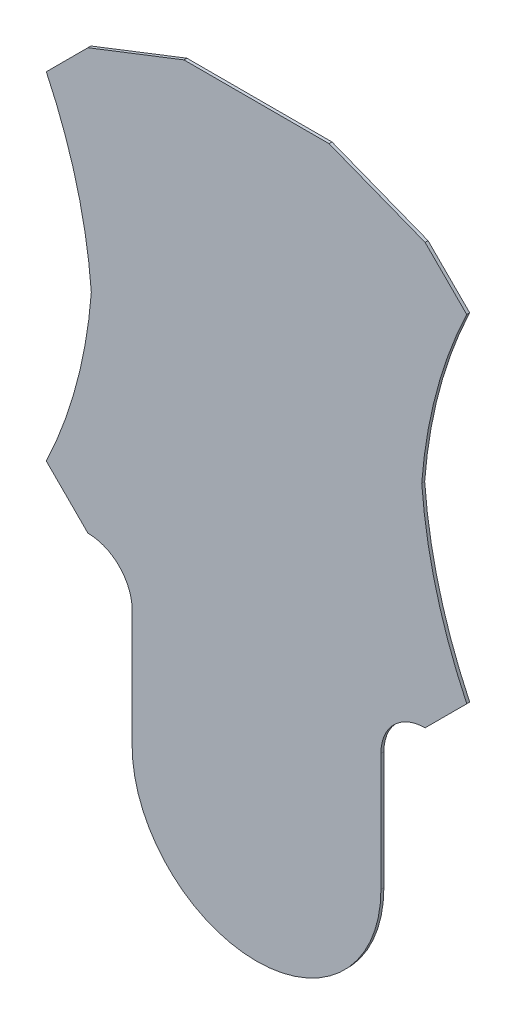
ISO-10303-21;
HEADER;
FILE_DESCRIPTION(('STEP AP214'),'2;1');
FILE_NAME('part.step','',(''),(''),'','','');
FILE_SCHEMA(('AUTOMOTIVE_DESIGN { 1 0 10303 214 1 1 1 1 }'));
ENDSEC;
DATA;
#1=APPLICATION_CONTEXT('core data for automotive mechanical design processes');
#2=APPLICATION_PROTOCOL_DEFINITION('international standard','automotive_design',2000,#1);
#3=PRODUCT_CONTEXT('',#1,'mechanical');
#4=PRODUCT('Part','Part','',(#3));
#5=PRODUCT_RELATED_PRODUCT_CATEGORY('part','',(#4));
#6=PRODUCT_DEFINITION_FORMATION('','',#4);
#7=PRODUCT_DEFINITION_CONTEXT('part definition',#1,'design');
#8=PRODUCT_DEFINITION('design','',#6,#7);
#9=PRODUCT_DEFINITION_SHAPE('','',#8);
#10=(LENGTH_UNIT() NAMED_UNIT(*) SI_UNIT(.MILLI.,.METRE.));
#11=(NAMED_UNIT(*) PLANE_ANGLE_UNIT() SI_UNIT($,.RADIAN.));
#12=(NAMED_UNIT(*) SI_UNIT($,.STERADIAN.) SOLID_ANGLE_UNIT());
#13=UNCERTAINTY_MEASURE_WITH_UNIT(LENGTH_MEASURE(1.E-05),#10,'distance_accuracy_value','');
#14=(GEOMETRIC_REPRESENTATION_CONTEXT(3) GLOBAL_UNCERTAINTY_ASSIGNED_CONTEXT((#13)) GLOBAL_UNIT_ASSIGNED_CONTEXT((#10,
#11,#12)) REPRESENTATION_CONTEXT('',''));
#15=CARTESIAN_POINT('',(0.,0.,0.));
#16=DIRECTION('',(0.,0.,1.));
#17=DIRECTION('',(1.,0.,0.));
#18=AXIS2_PLACEMENT_3D('',#15,#16,#17);
#19=CARTESIAN_POINT('',(142.766074480611,114.48180323315,2.));
#20=DIRECTION('',(-0.707106781186545,-0.70710678118655,0.));
#21=DIRECTION('',(0.70710678118655,-0.707106781186545,0.));
#22=AXIS2_PLACEMENT_3D('',#19,#20,#21);
#23=PLANE('',#22);
#24=DIRECTION('',(-0.70710678118655,0.707106781186545,0.));
#25=VECTOR('',#24,1.);
#26=CARTESIAN_POINT('',(142.766074480611,114.48180323315,0.));
#27=LINE('',#26,#25);
#28=CARTESIAN_POINT('',(142.766074480611,114.481803233151,0.));
#29=VERTEX_POINT('',#28);
#30=CARTESIAN_POINT('',(114.48180323315,142.766074480612,0.));
#31=VERTEX_POINT('',#30);
#32=EDGE_CURVE('E179',#29,#31,#27,.T.);
#33=ORIENTED_EDGE('',*,*,#32,.T.);
#34=DIRECTION('',(0.,0.,-1.));
#35=VECTOR('',#34,1.);
#36=CARTESIAN_POINT('',(114.48180323315,142.766074480612,2.));
#37=LINE('',#36,#35);
#38=CARTESIAN_POINT('',(114.48180323315,142.766074480612,2.));
#39=VERTEX_POINT('',#38);
#40=EDGE_CURVE('E11',#39,#31,#37,.T.);
#41=ORIENTED_EDGE('',*,*,#40,.F.);
#42=DIRECTION('',(-0.70710678118655,0.707106781186545,0.));
#43=VECTOR('',#42,1.);
#44=CARTESIAN_POINT('',(142.766074480611,114.48180323315,2.));
#45=LINE('',#44,#43);
#46=CARTESIAN_POINT('',(142.766074480611,114.481803233151,2.));
#47=VERTEX_POINT('',#46);
#48=EDGE_CURVE('E220',#47,#39,#45,.T.);
#49=ORIENTED_EDGE('',*,*,#48,.F.);
#50=DIRECTION('',(0.,0.,-1.));
#51=VECTOR('',#50,1.);
#52=CARTESIAN_POINT('',(142.766074480611,114.481803233151,2.));
#53=LINE('',#52,#51);
#54=EDGE_CURVE('E48',#47,#29,#53,.T.);
#55=ORIENTED_EDGE('',*,*,#54,.T.);
#56=EDGE_LOOP('',(#33,#41,#49,#55));
#57=FACE_BOUND('',#56,.T.);
#58=ADVANCED_FACE('F32',(#57),#23,.F.);
#59=CARTESIAN_POINT('',(114.48180323315,142.766074480612,2.));
#60=DIRECTION('',(-0.363403895673963,-0.931631691500985,0.));
#61=DIRECTION('',(0.931631691500985,-0.363403895673963,0.));
#62=AXIS2_PLACEMENT_3D('',#59,#60,#61);
#63=PLANE('',#62);
#64=DIRECTION('',(-0.931631691500985,0.363403895673963,0.));
#65=VECTOR('',#64,1.);
#66=CARTESIAN_POINT('',(114.48180323315,142.766074480612,0.));
#67=LINE('',#66,#65);
#68=CARTESIAN_POINT('',(49.2675848280858,168.204347177787,0.));
#69=VERTEX_POINT('',#68);
#70=EDGE_CURVE('E181',#31,#69,#67,.T.);
#71=ORIENTED_EDGE('',*,*,#70,.T.);
#72=DIRECTION('',(0.,0.,-1.));
#73=VECTOR('',#72,1.);
#74=CARTESIAN_POINT('',(49.2675848280858,168.204347177787,2.));
#75=LINE('',#74,#73);
#76=CARTESIAN_POINT('',(49.2675848280858,168.204347177787,2.));
#77=VERTEX_POINT('',#76);
#78=EDGE_CURVE('E40',#77,#69,#75,.T.);
#79=ORIENTED_EDGE('',*,*,#78,.F.);
#80=DIRECTION('',(-0.931631691500985,0.363403895673963,0.));
#81=VECTOR('',#80,1.);
#82=CARTESIAN_POINT('',(114.48180323315,142.766074480612,2.));
#83=LINE('',#82,#81);
#84=EDGE_CURVE('E111',#39,#77,#83,.T.);
#85=ORIENTED_EDGE('',*,*,#84,.F.);
#86=ORIENTED_EDGE('',*,*,#40,.T.);
#87=EDGE_LOOP('',(#71,#79,#85,#86));
#88=FACE_BOUND('',#87,.T.);
#89=ADVANCED_FACE('F252',(#88),#63,.F.);
#90=CARTESIAN_POINT('',(-49.2675848280858,168.204347177787,2.));
#91=DIRECTION('',(0.,1.,0.));
#92=DIRECTION('',(0.,0.,1.));
#93=AXIS2_PLACEMENT_3D('',#90,#91,#92);
#94=PLANE('',#93);
#95=DIRECTION('',(1.,0.,0.));
#96=VECTOR('',#95,1.);
#97=CARTESIAN_POINT('',(-49.2675848280858,168.204347177787,0.));
#98=LINE('',#97,#96);
#99=CARTESIAN_POINT('',(-49.2675848280858,168.204347177787,0.));
#100=VERTEX_POINT('',#99);
#101=EDGE_CURVE('E184',#100,#69,#98,.T.);
#102=ORIENTED_EDGE('',*,*,#101,.F.);
#103=DIRECTION('',(0.,0.,-1.));
#104=VECTOR('',#103,1.);
#105=CARTESIAN_POINT('',(-49.2675848280858,168.204347177787,2.));
#106=LINE('',#105,#104);
#107=CARTESIAN_POINT('',(-49.2675848280858,168.204347177787,2.));
#108=VERTEX_POINT('',#107);
#109=EDGE_CURVE('E245',#108,#100,#106,.T.);
#110=ORIENTED_EDGE('',*,*,#109,.F.);
#111=DIRECTION('',(1.,0.,0.));
#112=VECTOR('',#111,1.);
#113=CARTESIAN_POINT('',(-49.2675848280858,168.204347177787,2.));
#114=LINE('',#113,#112);
#115=EDGE_CURVE('E251',#108,#77,#114,.T.);
#116=ORIENTED_EDGE('',*,*,#115,.T.);
#117=ORIENTED_EDGE('',*,*,#78,.T.);
#118=EDGE_LOOP('',(#102,#110,#116,#117));
#119=FACE_BOUND('',#118,.T.);
#120=ADVANCED_FACE('F249',(#119),#94,.T.);
#121=CARTESIAN_POINT('',(-114.48180323315,142.766074480612,2.));
#122=DIRECTION('',(-0.363403895673964,0.931631691500985,0.));
#123=DIRECTION('',(-0.931631691500985,-0.363403895673964,0.));
#124=AXIS2_PLACEMENT_3D('',#121,#122,#123);
#125=PLANE('',#124);
#126=DIRECTION('',(0.931631691500985,0.363403895673964,0.));
#127=VECTOR('',#126,1.);
#128=CARTESIAN_POINT('',(-114.48180323315,142.766074480612,0.));
#129=LINE('',#128,#127);
#130=CARTESIAN_POINT('',(-114.48180323315,142.766074480612,0.));
#131=VERTEX_POINT('',#130);
#132=EDGE_CURVE('E187',#131,#100,#129,.T.);
#133=ORIENTED_EDGE('',*,*,#132,.F.);
#134=DIRECTION('',(0.,0.,-1.));
#135=VECTOR('',#134,1.);
#136=CARTESIAN_POINT('',(-114.48180323315,142.766074480612,2.));
#137=LINE('',#136,#135);
#138=CARTESIAN_POINT('',(-114.48180323315,142.766074480612,2.));
#139=VERTEX_POINT('',#138);
#140=EDGE_CURVE('E243',#139,#131,#137,.T.);
#141=ORIENTED_EDGE('',*,*,#140,.F.);
#142=DIRECTION('',(0.931631691500985,0.363403895673964,0.));
#143=VECTOR('',#142,1.);
#144=CARTESIAN_POINT('',(-114.48180323315,142.766074480612,2.));
#145=LINE('',#144,#143);
#146=EDGE_CURVE('E263',#139,#108,#145,.T.);
#147=ORIENTED_EDGE('',*,*,#146,.T.);
#148=ORIENTED_EDGE('',*,*,#109,.T.);
#149=EDGE_LOOP('',(#133,#141,#147,#148));
#150=FACE_BOUND('',#149,.T.);
#151=ADVANCED_FACE('F260',(#150),#125,.T.);
#152=CARTESIAN_POINT('',(-142.766074480611,114.48180323315,2.));
#153=DIRECTION('',(-0.707106781186545,0.70710678118655,0.));
#154=DIRECTION('',(-0.70710678118655,-0.707106781186545,0.));
#155=AXIS2_PLACEMENT_3D('',#152,#153,#154);
#156=PLANE('',#155);
#157=DIRECTION('',(0.70710678118655,0.707106781186545,0.));
#158=VECTOR('',#157,1.);
#159=CARTESIAN_POINT('',(-142.766074480611,114.48180323315,0.));
#160=LINE('',#159,#158);
#161=CARTESIAN_POINT('',(-142.766074480611,114.48180323315,0.));
#162=VERTEX_POINT('',#161);
#163=EDGE_CURVE('E190',#162,#131,#160,.T.);
#164=ORIENTED_EDGE('',*,*,#163,.F.);
#165=DIRECTION('',(0.,0.,-1.));
#166=VECTOR('',#165,1.);
#167=CARTESIAN_POINT('',(-142.766074480611,114.48180323315,2.));
#168=LINE('',#167,#166);
#169=CARTESIAN_POINT('',(-142.766074480611,114.48180323315,2.));
#170=VERTEX_POINT('',#169);
#171=EDGE_CURVE('E241',#170,#162,#168,.T.);
#172=ORIENTED_EDGE('',*,*,#171,.F.);
#173=DIRECTION('',(0.70710678118655,0.707106781186545,0.));
#174=VECTOR('',#173,1.);
#175=CARTESIAN_POINT('',(-142.766074480611,114.48180323315,2.));
#176=LINE('',#175,#174);
#177=EDGE_CURVE('E267',#170,#139,#176,.T.);
#178=ORIENTED_EDGE('',*,*,#177,.T.);
#179=ORIENTED_EDGE('',*,*,#140,.T.);
#180=EDGE_LOOP('',(#164,#172,#178,#179));
#181=FACE_BOUND('',#180,.T.);
#182=ADVANCED_FACE('F315',(#181),#156,.T.);
#183=CARTESIAN_POINT('',(-433.105343734515,-24.3794114136365,2.));
#184=DIRECTION('',(0.,0.,-1.));
#185=DIRECTION('',(-1.,0.,0.));
#186=AXIS2_PLACEMENT_3D('',#183,#184,#185);
#187=CYLINDRICAL_SURFACE('',#186,321.837425114097);
#188=CARTESIAN_POINT('',(-433.105343734515,-24.3794114136365,0.));
#189=DIRECTION('',(0.,0.,-1.));
#190=DIRECTION('',(-1.,0.,0.));
#191=AXIS2_PLACEMENT_3D('',#188,#189,#190);
#192=CIRCLE('',#191,321.837425114097);
#193=CARTESIAN_POINT('',(-112.192625845061,0.,0.));
#194=VERTEX_POINT('',#193);
#195=EDGE_CURVE('E193',#162,#194,#192,.T.);
#196=ORIENTED_EDGE('',*,*,#195,.T.);
#197=DIRECTION('',(0.,0.,-1.));
#198=VECTOR('',#197,1.);
#199=CARTESIAN_POINT('',(-112.192625845061,0.,2.));
#200=LINE('',#199,#198);
#201=CARTESIAN_POINT('',(-112.192625845061,0.,2.));
#202=VERTEX_POINT('',#201);
#203=EDGE_CURVE('E239',#202,#194,#200,.T.);
#204=ORIENTED_EDGE('',*,*,#203,.F.);
#205=CARTESIAN_POINT('',(-433.105343734515,-24.3794114136365,2.));
#206=DIRECTION('',(0.,0.,-1.));
#207=DIRECTION('',(-1.,0.,0.));
#208=AXIS2_PLACEMENT_3D('',#205,#206,#207);
#209=CIRCLE('',#208,321.837425114097);
#210=EDGE_CURVE('E273',#170,#202,#209,.T.);
#211=ORIENTED_EDGE('',*,*,#210,.F.);
#212=ORIENTED_EDGE('',*,*,#171,.T.);
#213=EDGE_LOOP('',(#196,#204,#211,#212));
#214=FACE_BOUND('',#213,.T.);
#215=ADVANCED_FACE('F318',(#214),#187,.F.);
#216=CARTESIAN_POINT('',(-433.105343734515,24.3794114136365,2.));
#217=DIRECTION('',(0.,0.,-1.));
#218=DIRECTION('',(-1.,0.,0.));
#219=AXIS2_PLACEMENT_3D('',#216,#217,#218);
#220=CYLINDRICAL_SURFACE('',#219,321.837425114097);
#221=CARTESIAN_POINT('',(-433.105343734515,24.3794114136365,0.));
#222=DIRECTION('',(0.,0.,1.));
#223=DIRECTION('',(1.,0.,0.));
#224=AXIS2_PLACEMENT_3D('',#221,#222,#223);
#225=CIRCLE('',#224,321.837425114097);
#226=CARTESIAN_POINT('',(-142.766074480611,-114.48180323315,0.));
#227=VERTEX_POINT('',#226);
#228=EDGE_CURVE('E196',#227,#194,#225,.T.);
#229=ORIENTED_EDGE('',*,*,#228,.F.);
#230=DIRECTION('',(0.,0.,-1.));
#231=VECTOR('',#230,1.);
#232=CARTESIAN_POINT('',(-142.766074480611,-114.48180323315,2.));
#233=LINE('',#232,#231);
#234=CARTESIAN_POINT('',(-142.766074480611,-114.48180323315,2.));
#235=VERTEX_POINT('',#234);
#236=EDGE_CURVE('E237',#235,#227,#233,.T.);
#237=ORIENTED_EDGE('',*,*,#236,.F.);
#238=CARTESIAN_POINT('',(-433.105343734515,24.3794114136365,2.));
#239=DIRECTION('',(0.,0.,1.));
#240=DIRECTION('',(1.,0.,0.));
#241=AXIS2_PLACEMENT_3D('',#238,#239,#240);
#242=CIRCLE('',#241,321.837425114097);
#243=EDGE_CURVE('E275',#235,#202,#242,.T.);
#244=ORIENTED_EDGE('',*,*,#243,.T.);
#245=ORIENTED_EDGE('',*,*,#203,.T.);
#246=EDGE_LOOP('',(#229,#237,#244,#245));
#247=FACE_BOUND('',#246,.T.);
#248=ADVANCED_FACE('F322',(#247),#220,.F.);
#249=CARTESIAN_POINT('',(-142.766074480611,-114.48180323315,2.));
#250=DIRECTION('',(0.707106781186545,0.70710678118655,0.));
#251=DIRECTION('',(-0.70710678118655,0.707106781186545,0.));
#252=AXIS2_PLACEMENT_3D('',#249,#250,#251);
#253=PLANE('',#252);
#254=DIRECTION('',(0.70710678118655,-0.707106781186545,0.));
#255=VECTOR('',#254,1.);
#256=CARTESIAN_POINT('',(-142.766074480611,-114.48180323315,0.));
#257=LINE('',#256,#255);
#258=CARTESIAN_POINT('',(-114.48180323315,-142.766074480612,0.));
#259=VERTEX_POINT('',#258);
#260=EDGE_CURVE('E199',#227,#259,#257,.T.);
#261=ORIENTED_EDGE('',*,*,#260,.T.);
#262=DIRECTION('',(0.,0.,-1.));
#263=VECTOR('',#262,1.);
#264=CARTESIAN_POINT('',(-114.48180323315,-142.766074480612,2.));
#265=LINE('',#264,#263);
#266=CARTESIAN_POINT('',(-114.48180323315,-142.766074480612,2.));
#267=VERTEX_POINT('',#266);
#268=EDGE_CURVE('E234',#267,#259,#265,.T.);
#269=ORIENTED_EDGE('',*,*,#268,.F.);
#270=DIRECTION('',(0.70710678118655,-0.707106781186545,0.));
#271=VECTOR('',#270,1.);
#272=CARTESIAN_POINT('',(-142.766074480611,-114.48180323315,2.));
#273=LINE('',#272,#271);
#274=EDGE_CURVE('E278',#235,#267,#273,.T.);
#275=ORIENTED_EDGE('',*,*,#274,.F.);
#276=ORIENTED_EDGE('',*,*,#236,.T.);
#277=EDGE_LOOP('',(#261,#269,#275,#276));
#278=FACE_BOUND('',#277,.T.);
#279=ADVANCED_FACE('F326',(#278),#253,.F.);
#280=CARTESIAN_POINT('',(-114.481803233161,-172.766074480616,2.));
#281=DIRECTION('',(0.,0.,-1.));
#282=DIRECTION('',(-1.,0.,0.));
#283=AXIS2_PLACEMENT_3D('',#280,#281,#282);
#284=CYLINDRICAL_SURFACE('',#283,30.0000000000042);
#285=CARTESIAN_POINT('',(-114.481803233161,-172.766074480616,0.));
#286=DIRECTION('',(0.,0.,-1.));
#287=DIRECTION('',(-1.,0.,0.));
#288=AXIS2_PLACEMENT_3D('',#285,#286,#287);
#289=CIRCLE('',#288,30.0000000000042);
#290=CARTESIAN_POINT('',(-84.4818032331563,-172.766074480612,0.));
#291=VERTEX_POINT('',#290);
#292=EDGE_CURVE('E201',#259,#291,#289,.T.);
#293=ORIENTED_EDGE('',*,*,#292,.T.);
#294=DIRECTION('',(0.,0.,-1.));
#295=VECTOR('',#294,1.);
#296=CARTESIAN_POINT('',(-84.4818032331563,-172.766074480612,2.));
#297=LINE('',#296,#295);
#298=CARTESIAN_POINT('',(-84.4818032331563,-172.766074480612,2.));
#299=VERTEX_POINT('',#298);
#300=EDGE_CURVE('E231',#299,#291,#297,.T.);
#301=ORIENTED_EDGE('',*,*,#300,.F.);
#302=CARTESIAN_POINT('',(-114.481803233161,-172.766074480616,2.));
#303=DIRECTION('',(0.,0.,-1.));
#304=DIRECTION('',(-1.,0.,0.));
#305=AXIS2_PLACEMENT_3D('',#302,#303,#304);
#306=CIRCLE('',#305,30.0000000000042);
#307=EDGE_CURVE('E280',#267,#299,#306,.T.);
#308=ORIENTED_EDGE('',*,*,#307,.F.);
#309=ORIENTED_EDGE('',*,*,#268,.T.);
#310=EDGE_LOOP('',(#293,#301,#308,#309));
#311=FACE_BOUND('',#310,.T.);
#312=ADVANCED_FACE('F330',(#311),#284,.F.);
#313=CARTESIAN_POINT('',(-84.4818032331563,-172.766074480612,2.));
#314=DIRECTION('',(1.,-1.53696499971545E-13,0.));
#315=DIRECTION('',(1.53696499971545E-13,1.,0.));
#316=AXIS2_PLACEMENT_3D('',#313,#314,#315);
#317=PLANE('',#316);
#318=DIRECTION('',(-1.53696499971545E-13,-1.,0.));
#319=VECTOR('',#318,1.);
#320=CARTESIAN_POINT('',(-84.4818032331563,-172.766074480612,0.));
#321=LINE('',#320,#319);
#322=CARTESIAN_POINT('',(-84.4818032331686,-252.766074480612,0.));
#323=VERTEX_POINT('',#322);
#324=EDGE_CURVE('E203',#291,#323,#321,.T.);
#325=ORIENTED_EDGE('',*,*,#324,.T.);
#326=DIRECTION('',(0.,0.,-1.));
#327=VECTOR('',#326,1.);
#328=CARTESIAN_POINT('',(-84.4818032331686,-252.766074480612,2.));
#329=LINE('',#328,#327);
#330=CARTESIAN_POINT('',(-84.4818032331686,-252.766074480612,2.));
#331=VERTEX_POINT('',#330);
#332=EDGE_CURVE('E228',#331,#323,#329,.T.);
#333=ORIENTED_EDGE('',*,*,#332,.F.);
#334=DIRECTION('',(-1.53696499971545E-13,-1.,0.));
#335=VECTOR('',#334,1.);
#336=CARTESIAN_POINT('',(-84.4818032331563,-172.766074480612,2.));
#337=LINE('',#336,#335);
#338=EDGE_CURVE('E282',#299,#331,#337,.T.);
#339=ORIENTED_EDGE('',*,*,#338,.F.);
#340=ORIENTED_EDGE('',*,*,#300,.T.);
#341=EDGE_LOOP('',(#325,#333,#339,#340));
#342=FACE_BOUND('',#341,.T.);
#343=ADVANCED_FACE('F334',(#342),#317,.F.);
#344=CARTESIAN_POINT('',(0.,-252.766074480612,2.));
#345=DIRECTION('',(0.,0.,-1.));
#346=DIRECTION('',(-1.,0.,0.));
#347=AXIS2_PLACEMENT_3D('',#344,#345,#346);
#348=CYLINDRICAL_SURFACE('',#347,84.4818032331687);
#349=CARTESIAN_POINT('',(0.,-252.766074480612,0.));
#350=DIRECTION('',(0.,0.,1.));
#351=DIRECTION('',(1.,0.,0.));
#352=AXIS2_PLACEMENT_3D('',#349,#350,#351);
#353=CIRCLE('',#352,84.4818032331687);
#354=CARTESIAN_POINT('',(84.4818032331687,-252.766074480612,0.));
#355=VERTEX_POINT('',#354);
#356=EDGE_CURVE('E205',#323,#355,#353,.T.);
#357=ORIENTED_EDGE('',*,*,#356,.T.);
#358=DIRECTION('',(0.,0.,-1.));
#359=VECTOR('',#358,1.);
#360=CARTESIAN_POINT('',(84.4818032331687,-252.766074480612,2.));
#361=LINE('',#360,#359);
#362=CARTESIAN_POINT('',(84.4818032331687,-252.766074480612,2.));
#363=VERTEX_POINT('',#362);
#364=EDGE_CURVE('E226',#363,#355,#361,.T.);
#365=ORIENTED_EDGE('',*,*,#364,.F.);
#366=CARTESIAN_POINT('',(0.,-252.766074480612,2.));
#367=DIRECTION('',(0.,0.,1.));
#368=DIRECTION('',(1.,0.,0.));
#369=AXIS2_PLACEMENT_3D('',#366,#367,#368);
#370=CIRCLE('',#369,84.4818032331687);
#371=EDGE_CURVE('E284',#331,#363,#370,.T.);
#372=ORIENTED_EDGE('',*,*,#371,.F.);
#373=ORIENTED_EDGE('',*,*,#332,.T.);
#374=EDGE_LOOP('',(#357,#365,#372,#373));
#375=FACE_BOUND('',#374,.T.);
#376=ADVANCED_FACE('F338',(#375),#348,.T.);
#377=CARTESIAN_POINT('',(84.4818032331564,-172.766074480612,2.));
#378=DIRECTION('',(1.,1.53696499971545E-13,0.));
#379=DIRECTION('',(-1.53696499971545E-13,1.,0.));
#380=AXIS2_PLACEMENT_3D('',#377,#378,#379);
#381=PLANE('',#380);
#382=DIRECTION('',(1.53696499971545E-13,-1.,0.));
#383=VECTOR('',#382,1.);
#384=CARTESIAN_POINT('',(84.4818032331564,-172.766074480612,0.));
#385=LINE('',#384,#383);
#386=CARTESIAN_POINT('',(84.4818032331564,-172.766074480612,0.));
#387=VERTEX_POINT('',#386);
#388=EDGE_CURVE('E208',#387,#355,#385,.T.);
#389=ORIENTED_EDGE('',*,*,#388,.F.);
#390=DIRECTION('',(0.,0.,-1.));
#391=VECTOR('',#390,1.);
#392=CARTESIAN_POINT('',(84.4818032331564,-172.766074480612,2.));
#393=LINE('',#392,#391);
#394=CARTESIAN_POINT('',(84.4818032331564,-172.766074480612,2.));
#395=VERTEX_POINT('',#394);
#396=EDGE_CURVE('E224',#395,#387,#393,.T.);
#397=ORIENTED_EDGE('',*,*,#396,.F.);
#398=DIRECTION('',(1.53696499971545E-13,-1.,0.));
#399=VECTOR('',#398,1.);
#400=CARTESIAN_POINT('',(84.4818032331564,-172.766074480612,2.));
#401=LINE('',#400,#399);
#402=EDGE_CURVE('E174',#395,#363,#401,.T.);
#403=ORIENTED_EDGE('',*,*,#402,.T.);
#404=ORIENTED_EDGE('',*,*,#364,.T.);
#405=EDGE_LOOP('',(#389,#397,#403,#404));
#406=FACE_BOUND('',#405,.T.);
#407=ADVANCED_FACE('F288',(#406),#381,.T.);
#408=CARTESIAN_POINT('',(114.481803233161,-172.766074480616,2.));
#409=DIRECTION('',(0.,0.,-1.));
#410=DIRECTION('',(-1.,0.,0.));
#411=AXIS2_PLACEMENT_3D('',#408,#409,#410);
#412=CYLINDRICAL_SURFACE('',#411,30.0000000000042);
#413=CARTESIAN_POINT('',(114.481803233161,-172.766074480616,0.));
#414=DIRECTION('',(0.,0.,1.));
#415=DIRECTION('',(1.,0.,0.));
#416=AXIS2_PLACEMENT_3D('',#413,#414,#415);
#417=CIRCLE('',#416,30.0000000000042);
#418=CARTESIAN_POINT('',(114.48180323315,-142.766074480612,0.));
#419=VERTEX_POINT('',#418);
#420=EDGE_CURVE('E211',#419,#387,#417,.T.);
#421=ORIENTED_EDGE('',*,*,#420,.F.);
#422=DIRECTION('',(0.,0.,-1.));
#423=VECTOR('',#422,1.);
#424=CARTESIAN_POINT('',(114.48180323315,-142.766074480612,2.));
#425=LINE('',#424,#423);
#426=CARTESIAN_POINT('',(114.48180323315,-142.766074480612,2.));
#427=VERTEX_POINT('',#426);
#428=EDGE_CURVE('E160',#427,#419,#425,.T.);
#429=ORIENTED_EDGE('',*,*,#428,.F.);
#430=CARTESIAN_POINT('',(114.481803233161,-172.766074480616,2.));
#431=DIRECTION('',(0.,0.,1.));
#432=DIRECTION('',(1.,0.,0.));
#433=AXIS2_PLACEMENT_3D('',#430,#431,#432);
#434=CIRCLE('',#433,30.0000000000042);
#435=EDGE_CURVE('E172',#427,#395,#434,.T.);
#436=ORIENTED_EDGE('',*,*,#435,.T.);
#437=ORIENTED_EDGE('',*,*,#396,.T.);
#438=EDGE_LOOP('',(#421,#429,#436,#437));
#439=FACE_BOUND('',#438,.T.);
#440=ADVANCED_FACE('F293',(#439),#412,.F.);
#441=CARTESIAN_POINT('',(142.766074480611,-114.48180323315,2.));
#442=DIRECTION('',(0.707106781186545,-0.70710678118655,0.));
#443=DIRECTION('',(0.70710678118655,0.707106781186545,0.));
#444=AXIS2_PLACEMENT_3D('',#441,#442,#443);
#445=PLANE('',#444);
#446=DIRECTION('',(-0.70710678118655,-0.707106781186545,0.));
#447=VECTOR('',#446,1.);
#448=CARTESIAN_POINT('',(142.766074480611,-114.48180323315,0.));
#449=LINE('',#448,#447);
#450=CARTESIAN_POINT('',(142.766074480611,-114.48180323315,0.));
#451=VERTEX_POINT('',#450);
#452=EDGE_CURVE('E157',#451,#419,#449,.T.);
#453=ORIENTED_EDGE('',*,*,#452,.F.);
#454=DIRECTION('',(0.,0.,-1.));
#455=VECTOR('',#454,1.);
#456=CARTESIAN_POINT('',(142.766074480611,-114.48180323315,2.));
#457=LINE('',#456,#455);
#458=CARTESIAN_POINT('',(142.766074480611,-114.48180323315,2.));
#459=VERTEX_POINT('',#458);
#460=EDGE_CURVE('E151',#459,#451,#457,.T.);
#461=ORIENTED_EDGE('',*,*,#460,.F.);
#462=DIRECTION('',(-0.70710678118655,-0.707106781186545,0.));
#463=VECTOR('',#462,1.);
#464=CARTESIAN_POINT('',(142.766074480611,-114.48180323315,2.));
#465=LINE('',#464,#463);
#466=EDGE_CURVE('E155',#459,#427,#465,.T.);
#467=ORIENTED_EDGE('',*,*,#466,.T.);
#468=ORIENTED_EDGE('',*,*,#428,.T.);
#469=EDGE_LOOP('',(#453,#461,#467,#468));
#470=FACE_BOUND('',#469,.T.);
#471=ADVANCED_FACE('F153',(#470),#445,.T.);
#472=CARTESIAN_POINT('',(433.105343734515,24.3794114136366,2.));
#473=DIRECTION('',(0.,0.,-1.));
#474=DIRECTION('',(-1.,0.,0.));
#475=AXIS2_PLACEMENT_3D('',#472,#473,#474);
#476=CYLINDRICAL_SURFACE('',#475,321.837425114097);
#477=CARTESIAN_POINT('',(433.105343734515,24.3794114136366,0.));
#478=DIRECTION('',(0.,0.,-1.));
#479=DIRECTION('',(-1.,0.,0.));
#480=AXIS2_PLACEMENT_3D('',#477,#478,#479);
#481=CIRCLE('',#480,321.837425114097);
#482=CARTESIAN_POINT('',(112.192625845061,0.,0.));
#483=VERTEX_POINT('',#482);
#484=EDGE_CURVE('E215',#451,#483,#481,.T.);
#485=ORIENTED_EDGE('',*,*,#484,.T.);
#486=DIRECTION('',(0.,0.,-1.));
#487=VECTOR('',#486,1.);
#488=CARTESIAN_POINT('',(112.192625845061,0.,2.));
#489=LINE('',#488,#487);
#490=CARTESIAN_POINT('',(112.192625845061,0.,2.));
#491=VERTEX_POINT('',#490);
#492=EDGE_CURVE('E99',#491,#483,#489,.T.);
#493=ORIENTED_EDGE('',*,*,#492,.F.);
#494=CARTESIAN_POINT('',(433.105343734515,24.3794114136366,2.));
#495=DIRECTION('',(0.,0.,-1.));
#496=DIRECTION('',(-1.,0.,0.));
#497=AXIS2_PLACEMENT_3D('',#494,#495,#496);
#498=CIRCLE('',#497,321.837425114097);
#499=EDGE_CURVE('E162',#459,#491,#498,.T.);
#500=ORIENTED_EDGE('',*,*,#499,.F.);
#501=ORIENTED_EDGE('',*,*,#460,.T.);
#502=EDGE_LOOP('',(#485,#493,#500,#501));
#503=FACE_BOUND('',#502,.T.);
#504=ADVANCED_FACE('F163',(#503),#476,.F.);
#505=CARTESIAN_POINT('',(433.105343734515,-24.3794114136364,2.));
#506=DIRECTION('',(0.,0.,-1.));
#507=DIRECTION('',(-1.,0.,0.));
#508=AXIS2_PLACEMENT_3D('',#505,#506,#507);
#509=CYLINDRICAL_SURFACE('',#508,321.837425114097);
#510=CARTESIAN_POINT('',(433.105343734515,-24.3794114136364,0.));
#511=DIRECTION('',(0.,0.,1.));
#512=DIRECTION('',(1.,0.,0.));
#513=AXIS2_PLACEMENT_3D('',#510,#511,#512);
#514=CIRCLE('',#513,321.837425114097);
#515=EDGE_CURVE('E217',#29,#483,#514,.T.);
#516=ORIENTED_EDGE('',*,*,#515,.F.);
#517=ORIENTED_EDGE('',*,*,#54,.F.);
#518=CARTESIAN_POINT('',(433.105343734515,-24.3794114136364,2.));
#519=DIRECTION('',(0.,0.,1.));
#520=DIRECTION('',(1.,0.,0.));
#521=AXIS2_PLACEMENT_3D('',#518,#519,#520);
#522=CIRCLE('',#521,321.837425114097);
#523=EDGE_CURVE('E166',#47,#491,#522,.T.);
#524=ORIENTED_EDGE('',*,*,#523,.T.);
#525=ORIENTED_EDGE('',*,*,#492,.T.);
#526=EDGE_LOOP('',(#516,#517,#524,#525));
#527=FACE_BOUND('',#526,.T.);
#528=ADVANCED_FACE('F294',(#527),#509,.F.);
#529=CARTESIAN_POINT('',(-433.105343734515,-24.3794114136365,2.));
#530=DIRECTION('',(0.,0.,-1.));
#531=DIRECTION('',(-1.,0.,0.));
#532=AXIS2_PLACEMENT_3D('',#529,#530,#531);
#533=PLANE('',#532);
#534=ORIENTED_EDGE('',*,*,#48,.T.);
#535=ORIENTED_EDGE('',*,*,#84,.T.);
#536=ORIENTED_EDGE('',*,*,#115,.F.);
#537=ORIENTED_EDGE('',*,*,#146,.F.);
#538=ORIENTED_EDGE('',*,*,#177,.F.);
#539=ORIENTED_EDGE('',*,*,#210,.T.);
#540=ORIENTED_EDGE('',*,*,#243,.F.);
#541=ORIENTED_EDGE('',*,*,#274,.T.);
#542=ORIENTED_EDGE('',*,*,#307,.T.);
#543=ORIENTED_EDGE('',*,*,#338,.T.);
#544=ORIENTED_EDGE('',*,*,#371,.T.);
#545=ORIENTED_EDGE('',*,*,#402,.F.);
#546=ORIENTED_EDGE('',*,*,#435,.F.);
#547=ORIENTED_EDGE('',*,*,#466,.F.);
#548=ORIENTED_EDGE('',*,*,#499,.T.);
#549=ORIENTED_EDGE('',*,*,#523,.F.);
#550=EDGE_LOOP('',(#534,#535,#536,#537,#538,#539,#540,#541,#542,#543,#544,#545,#546,#547,#548,#549));
#551=FACE_BOUND('',#550,.T.);
#552=ADVANCED_FACE('F169',(#551),#533,.F.);
#553=CARTESIAN_POINT('',(-433.105343734515,-24.3794114136365,0.));
#554=DIRECTION('',(0.,0.,-1.));
#555=DIRECTION('',(-1.,0.,0.));
#556=AXIS2_PLACEMENT_3D('',#553,#554,#555);
#557=PLANE('',#556);
#558=ORIENTED_EDGE('',*,*,#32,.F.);
#559=ORIENTED_EDGE('',*,*,#515,.T.);
#560=ORIENTED_EDGE('',*,*,#484,.F.);
#561=ORIENTED_EDGE('',*,*,#452,.T.);
#562=ORIENTED_EDGE('',*,*,#420,.T.);
#563=ORIENTED_EDGE('',*,*,#388,.T.);
#564=ORIENTED_EDGE('',*,*,#356,.F.);
#565=ORIENTED_EDGE('',*,*,#324,.F.);
#566=ORIENTED_EDGE('',*,*,#292,.F.);
#567=ORIENTED_EDGE('',*,*,#260,.F.);
#568=ORIENTED_EDGE('',*,*,#228,.T.);
#569=ORIENTED_EDGE('',*,*,#195,.F.);
#570=ORIENTED_EDGE('',*,*,#163,.T.);
#571=ORIENTED_EDGE('',*,*,#132,.T.);
#572=ORIENTED_EDGE('',*,*,#101,.T.);
#573=ORIENTED_EDGE('',*,*,#70,.F.);
#574=EDGE_LOOP('',(#558,#559,#560,#561,#562,#563,#564,#565,#566,#567,#568,#569,#570,#571,#572,#573));
#575=FACE_BOUND('',#574,.T.);
#576=ADVANCED_FACE('F255',(#575),#557,.T.);
#577=CLOSED_SHELL('',(#58,#89,#120,#151,#182,#215,#248,#279,#312,#343,#376,#407,#440,#471,#504,
#528,#552,#576));
#578=MANIFOLD_SOLID_BREP('B2',#577);
#579=ADVANCED_BREP_SHAPE_REPRESENTATION('',(#18,#578),#14);
#580=SHAPE_DEFINITION_REPRESENTATION(#9,#579);
ENDSEC;
END-ISO-10303-21;
